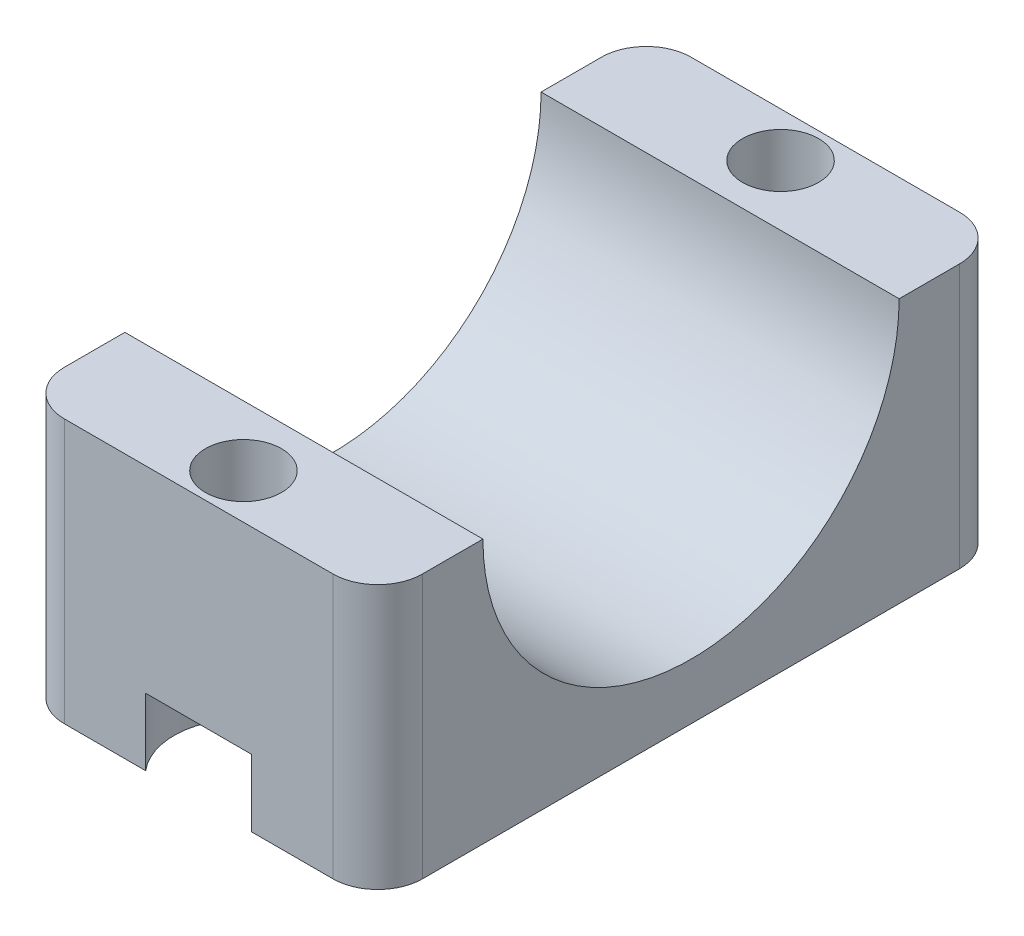
ISO-10303-21;
HEADER;
FILE_DESCRIPTION(('STEP AP214'),'2;1');
FILE_NAME('part.step','',(''),(''),'','','');
FILE_SCHEMA(('AUTOMOTIVE_DESIGN { 1 0 10303 214 1 1 1 1 }'));
ENDSEC;
DATA;
#1=APPLICATION_CONTEXT('core data for automotive mechanical design processes');
#2=APPLICATION_PROTOCOL_DEFINITION('international standard','automotive_design',2000,#1);
#3=PRODUCT_CONTEXT('',#1,'mechanical');
#4=PRODUCT('Part','Part','',(#3));
#5=PRODUCT_RELATED_PRODUCT_CATEGORY('part','',(#4));
#6=PRODUCT_DEFINITION_FORMATION('','',#4);
#7=PRODUCT_DEFINITION_CONTEXT('part definition',#1,'design');
#8=PRODUCT_DEFINITION('design','',#6,#7);
#9=PRODUCT_DEFINITION_SHAPE('','',#8);
#10=(LENGTH_UNIT() NAMED_UNIT(*) SI_UNIT(.MILLI.,.METRE.));
#11=(NAMED_UNIT(*) PLANE_ANGLE_UNIT() SI_UNIT($,.RADIAN.));
#12=(NAMED_UNIT(*) SI_UNIT($,.STERADIAN.) SOLID_ANGLE_UNIT());
#13=UNCERTAINTY_MEASURE_WITH_UNIT(LENGTH_MEASURE(1.E-05),#10,'distance_accuracy_value','');
#14=(GEOMETRIC_REPRESENTATION_CONTEXT(3) GLOBAL_UNCERTAINTY_ASSIGNED_CONTEXT((#13)) GLOBAL_UNIT_ASSIGNED_CONTEXT((#10,
#11,#12)) REPRESENTATION_CONTEXT('',''));
#15=CARTESIAN_POINT('',(0.,0.,0.));
#16=DIRECTION('',(0.,0.,1.));
#17=DIRECTION('',(1.,0.,0.));
#18=AXIS2_PLACEMENT_3D('',#15,#16,#17);
#19=CARTESIAN_POINT('',(58.,495.59,461.75));
#20=DIRECTION('',(0.,-1.,0.));
#21=DIRECTION('',(0.,0.,-1.));
#22=AXIS2_PLACEMENT_3D('',#19,#20,#21);
#23=PLANE('',#22);
#24=CARTESIAN_POINT('',(58.,495.59,461.75));
#25=DIRECTION('',(0.,-1.,0.));
#26=DIRECTION('',(1.,0.,0.));
#27=AXIS2_PLACEMENT_3D('',#24,#25,#26);
#28=CIRCLE('',#27,1.7);
#29=CARTESIAN_POINT('',(59.7,495.59,461.75));
#30=VERTEX_POINT('',#29);
#31=EDGE_CURVE('E42',#30,#30,#28,.T.);
#32=ORIENTED_EDGE('',*,*,#31,.F.);
#33=EDGE_LOOP('',(#32));
#34=FACE_BOUND('',#33,.T.);
#35=DIRECTION('',(1.,0.,0.));
#36=VECTOR('',#35,1.);
#37=CARTESIAN_POINT('',(54.,495.59,463.75));
#38=LINE('',#37,#36);
#39=CARTESIAN_POINT('',(55.631456143535,495.59,463.75));
#40=VERTEX_POINT('',#39);
#41=CARTESIAN_POINT('',(60.368543856465,495.59,463.75));
#42=VERTEX_POINT('',#41);
#43=EDGE_CURVE('E210',#40,#42,#38,.T.);
#44=ORIENTED_EDGE('',*,*,#43,.F.);
#45=CARTESIAN_POINT('',(58.,495.59,461.75));
#46=DIRECTION('',(0.,1.,0.));
#47=DIRECTION('',(0.764046405311039,0.,0.645161290323033));
#48=AXIS2_PLACEMENT_3D('',#45,#46,#47);
#49=CIRCLE('',#48,3.1);
#50=EDGE_CURVE('E217',#42,#40,#49,.T.);
#51=ORIENTED_EDGE('',*,*,#50,.F.);
#52=EDGE_LOOP('',(#44,#51));
#53=FACE_BOUND('',#52,.T.);
#54=ADVANCED_FACE('F15',(#34,#53),#23,.T.);
#55=CARTESIAN_POINT('',(58.,495.59,437.75));
#56=DIRECTION('',(0.,-1.,0.));
#57=DIRECTION('',(0.,0.,-1.));
#58=AXIS2_PLACEMENT_3D('',#55,#56,#57);
#59=PLANE('',#58);
#60=CARTESIAN_POINT('',(58.,495.59,437.75));
#61=DIRECTION('',(0.,-1.,0.));
#62=DIRECTION('',(1.,0.,0.));
#63=AXIS2_PLACEMENT_3D('',#60,#61,#62);
#64=CIRCLE('',#63,1.7);
#65=CARTESIAN_POINT('',(59.7,495.59,437.75));
#66=VERTEX_POINT('',#65);
#67=EDGE_CURVE('E9',#66,#66,#64,.T.);
#68=ORIENTED_EDGE('',*,*,#67,.F.);
#69=EDGE_LOOP('',(#68));
#70=FACE_BOUND('',#69,.T.);
#71=DIRECTION('',(1.,0.,0.));
#72=VECTOR('',#71,1.);
#73=CARTESIAN_POINT('',(54.,495.59,435.75));
#74=LINE('',#73,#72);
#75=CARTESIAN_POINT('',(55.631456143535,495.59,435.75));
#76=VERTEX_POINT('',#75);
#77=CARTESIAN_POINT('',(60.368543856465,495.59,435.75));
#78=VERTEX_POINT('',#77);
#79=EDGE_CURVE('E191',#76,#78,#74,.T.);
#80=ORIENTED_EDGE('',*,*,#79,.T.);
#81=CARTESIAN_POINT('',(58.,495.59,437.75));
#82=DIRECTION('',(0.,1.,0.));
#83=DIRECTION('',(-0.764046405311039,0.,-0.645161290323033));
#84=AXIS2_PLACEMENT_3D('',#81,#82,#83);
#85=CIRCLE('',#84,3.1);
#86=EDGE_CURVE('E195',#76,#78,#85,.T.);
#87=ORIENTED_EDGE('',*,*,#86,.F.);
#88=EDGE_LOOP('',(#80,#87));
#89=FACE_BOUND('',#88,.T.);
#90=ADVANCED_FACE('F361',(#70,#89),#59,.T.);
#91=CARTESIAN_POINT('',(58.,491.59,437.75));
#92=DIRECTION('',(0.,-1.,0.));
#93=DIRECTION('',(1.,0.,0.));
#94=AXIS2_PLACEMENT_3D('',#91,#92,#93);
#95=CYLINDRICAL_SURFACE('',#94,1.7);
#96=DIRECTION('',(0.,1.,0.));
#97=VECTOR('',#96,1.);
#98=CARTESIAN_POINT('',(59.7,491.59,437.75));
#99=LINE('',#98,#97);
#100=CARTESIAN_POINT('',(59.7,504.39,437.75));
#101=VERTEX_POINT('',#100);
#102=EDGE_CURVE('E23',#66,#101,#99,.T.);
#103=ORIENTED_EDGE('',*,*,#102,.T.);
#104=CARTESIAN_POINT('',(58.,504.39,437.75));
#105=DIRECTION('',(0.,-1.,0.));
#106=DIRECTION('',(1.,0.,0.));
#107=AXIS2_PLACEMENT_3D('',#104,#105,#106);
#108=CIRCLE('',#107,1.7);
#109=EDGE_CURVE('E164',#101,#101,#108,.T.);
#110=ORIENTED_EDGE('',*,*,#109,.F.);
#111=ORIENTED_EDGE('',*,*,#102,.F.);
#112=ORIENTED_EDGE('',*,*,#67,.T.);
#113=EDGE_LOOP('',(#103,#110,#111,#112));
#114=FACE_BOUND('',#113,.T.);
#115=ADVANCED_FACE('F163',(#114),#95,.F.);
#116=CARTESIAN_POINT('',(58.,491.59,461.75));
#117=DIRECTION('',(0.,-1.,0.));
#118=DIRECTION('',(1.,0.,0.));
#119=AXIS2_PLACEMENT_3D('',#116,#117,#118);
#120=CYLINDRICAL_SURFACE('',#119,1.7);
#121=DIRECTION('',(0.,1.,0.));
#122=VECTOR('',#121,1.);
#123=CARTESIAN_POINT('',(59.7,491.59,461.75));
#124=LINE('',#123,#122);
#125=CARTESIAN_POINT('',(59.7,504.39,461.75));
#126=VERTEX_POINT('',#125);
#127=EDGE_CURVE('E219',#30,#126,#124,.T.);
#128=ORIENTED_EDGE('',*,*,#127,.T.);
#129=CARTESIAN_POINT('',(58.,504.39,461.75));
#130=DIRECTION('',(0.,-1.,0.));
#131=DIRECTION('',(1.,0.,0.));
#132=AXIS2_PLACEMENT_3D('',#129,#130,#131);
#133=CIRCLE('',#132,1.7);
#134=EDGE_CURVE('E232',#126,#126,#133,.T.);
#135=ORIENTED_EDGE('',*,*,#134,.F.);
#136=ORIENTED_EDGE('',*,*,#127,.F.);
#137=ORIENTED_EDGE('',*,*,#31,.T.);
#138=EDGE_LOOP('',(#128,#135,#136,#137));
#139=FACE_BOUND('',#138,.T.);
#140=ADVANCED_FACE('F349',(#139),#120,.F.);
#141=CARTESIAN_POINT('',(58.,491.59,461.75));
#142=DIRECTION('',(0.,-1.,0.));
#143=DIRECTION('',(1.,0.,0.));
#144=AXIS2_PLACEMENT_3D('',#141,#142,#143);
#145=CYLINDRICAL_SURFACE('',#144,3.1);
#146=DIRECTION('',(0.,-1.,0.));
#147=VECTOR('',#146,1.);
#148=CARTESIAN_POINT('',(60.368543856465,491.59,463.75));
#149=LINE('',#148,#147);
#150=CARTESIAN_POINT('',(60.368543856462,492.59,463.75));
#151=VERTEX_POINT('',#150);
#152=EDGE_CURVE('E214',#42,#151,#149,.T.);
#153=ORIENTED_EDGE('',*,*,#152,.F.);
#154=ORIENTED_EDGE('',*,*,#50,.T.);
#155=DIRECTION('',(0.,-1.,0.));
#156=VECTOR('',#155,1.);
#157=CARTESIAN_POINT('',(55.631456143535,491.59,463.75));
#158=LINE('',#157,#156);
#159=CARTESIAN_POINT('',(55.631456143538,492.59,463.75));
#160=VERTEX_POINT('',#159);
#161=EDGE_CURVE('E207',#40,#160,#158,.T.);
#162=ORIENTED_EDGE('',*,*,#161,.T.);
#163=CARTESIAN_POINT('',(58.,492.59,461.75));
#164=DIRECTION('',(0.,1.,0.));
#165=DIRECTION('',(0.764046405311039,0.,0.645161290323033));
#166=AXIS2_PLACEMENT_3D('',#163,#164,#165);
#167=CIRCLE('',#166,3.1);
#168=EDGE_CURVE('E271',#151,#160,#167,.T.);
#169=ORIENTED_EDGE('',*,*,#168,.F.);
#170=EDGE_LOOP('',(#153,#154,#162,#169));
#171=FACE_BOUND('',#170,.T.);
#172=ADVANCED_FACE('F351',(#171),#145,.F.);
#173=CARTESIAN_POINT('',(50.,492.59,463.75));
#174=DIRECTION('',(0.,0.,1.));
#175=DIRECTION('',(1.,0.,0.));
#176=AXIS2_PLACEMENT_3D('',#173,#174,#175);
#177=PLANE('',#176);
#178=DIRECTION('',(1.,0.,0.));
#179=VECTOR('',#178,1.);
#180=CARTESIAN_POINT('',(50.,504.39,463.75));
#181=LINE('',#180,#179);
#182=CARTESIAN_POINT('',(52.,504.39,463.75));
#183=VERTEX_POINT('',#182);
#184=CARTESIAN_POINT('',(64.,504.39,463.75));
#185=VERTEX_POINT('',#184);
#186=EDGE_CURVE('E298',#183,#185,#181,.T.);
#187=ORIENTED_EDGE('',*,*,#186,.F.);
#188=DIRECTION('',(0.,1.,0.));
#189=VECTOR('',#188,1.);
#190=CARTESIAN_POINT('',(52.,492.59,463.75));
#191=LINE('',#190,#189);
#192=CARTESIAN_POINT('',(52.,492.59,463.75));
#193=VERTEX_POINT('',#192);
#194=EDGE_CURVE('E312',#193,#183,#191,.T.);
#195=ORIENTED_EDGE('',*,*,#194,.F.);
#196=DIRECTION('',(1.,0.,0.));
#197=VECTOR('',#196,1.);
#198=CARTESIAN_POINT('',(50.,492.59,463.75));
#199=LINE('',#198,#197);
#200=EDGE_CURVE('E303',#193,#160,#199,.T.);
#201=ORIENTED_EDGE('',*,*,#200,.T.);
#202=ORIENTED_EDGE('',*,*,#161,.F.);
#203=ORIENTED_EDGE('',*,*,#43,.T.);
#204=ORIENTED_EDGE('',*,*,#152,.T.);
#205=DIRECTION('',(1.,0.,0.));
#206=VECTOR('',#205,1.);
#207=CARTESIAN_POINT('',(50.,492.59,463.75));
#208=LINE('',#207,#206);
#209=CARTESIAN_POINT('',(64.,492.59,463.75));
#210=VERTEX_POINT('',#209);
#211=EDGE_CURVE('E267',#151,#210,#208,.T.);
#212=ORIENTED_EDGE('',*,*,#211,.T.);
#213=DIRECTION('',(0.,1.,0.));
#214=VECTOR('',#213,1.);
#215=CARTESIAN_POINT('',(64.,492.59,463.75));
#216=LINE('',#215,#214);
#217=EDGE_CURVE('E204',#210,#185,#216,.T.);
#218=ORIENTED_EDGE('',*,*,#217,.T.);
#219=EDGE_LOOP('',(#187,#195,#201,#202,#203,#204,#212,#218));
#220=FACE_BOUND('',#219,.T.);
#221=ADVANCED_FACE('F358',(#220),#177,.T.);
#222=CARTESIAN_POINT('',(64.,492.59,461.75));
#223=DIRECTION('',(0.,1.,0.));
#224=DIRECTION('',(1.,0.,0.));
#225=AXIS2_PLACEMENT_3D('',#222,#223,#224);
#226=CYLINDRICAL_SURFACE('',#225,2.);
#227=DIRECTION('',(0.,1.,0.));
#228=VECTOR('',#227,1.);
#229=CARTESIAN_POINT('',(66.,492.59,461.75));
#230=LINE('',#229,#228);
#231=CARTESIAN_POINT('',(66.,492.59,461.75));
#232=VERTEX_POINT('',#231);
#233=CARTESIAN_POINT('',(66.,504.39,461.75));
#234=VERTEX_POINT('',#233);
#235=EDGE_CURVE('E201',#232,#234,#230,.T.);
#236=ORIENTED_EDGE('',*,*,#235,.T.);
#237=CARTESIAN_POINT('',(64.,504.39,461.75));
#238=DIRECTION('',(0.,-1.,0.));
#239=DIRECTION('',(0.,0.,1.));
#240=AXIS2_PLACEMENT_3D('',#237,#238,#239);
#241=CIRCLE('',#240,2.);
#242=EDGE_CURVE('E337',#234,#185,#241,.T.);
#243=ORIENTED_EDGE('',*,*,#242,.T.);
#244=ORIENTED_EDGE('',*,*,#217,.F.);
#245=CARTESIAN_POINT('',(64.,492.59,461.75));
#246=DIRECTION('',(0.,-1.,0.));
#247=DIRECTION('',(0.,0.,1.));
#248=AXIS2_PLACEMENT_3D('',#245,#246,#247);
#249=CIRCLE('',#248,2.);
#250=EDGE_CURVE('E272',#232,#210,#249,.T.);
#251=ORIENTED_EDGE('',*,*,#250,.F.);
#252=EDGE_LOOP('',(#236,#243,#244,#251));
#253=FACE_BOUND('',#252,.T.);
#254=ADVANCED_FACE('F385',(#253),#226,.T.);
#255=CARTESIAN_POINT('',(66.,492.59,435.75));
#256=DIRECTION('',(1.,0.,0.));
#257=DIRECTION('',(0.,1.,0.));
#258=AXIS2_PLACEMENT_3D('',#255,#256,#257);
#259=PLANE('',#258);
#260=DIRECTION('',(0.,0.,1.));
#261=VECTOR('',#260,1.);
#262=CARTESIAN_POINT('',(66.,492.59,435.75));
#263=LINE('',#262,#261);
#264=CARTESIAN_POINT('',(66.,492.59,437.75));
#265=VERTEX_POINT('',#264);
#266=EDGE_CURVE('E262',#265,#232,#263,.T.);
#267=ORIENTED_EDGE('',*,*,#266,.F.);
#268=DIRECTION('',(0.,1.,0.));
#269=VECTOR('',#268,1.);
#270=CARTESIAN_POINT('',(66.,492.59,437.75));
#271=LINE('',#270,#269);
#272=CARTESIAN_POINT('',(66.,504.39,437.75));
#273=VERTEX_POINT('',#272);
#274=EDGE_CURVE('E198',#265,#273,#271,.T.);
#275=ORIENTED_EDGE('',*,*,#274,.T.);
#276=DIRECTION('',(0.,0.,1.));
#277=VECTOR('',#276,1.);
#278=CARTESIAN_POINT('',(66.,504.39,435.75));
#279=LINE('',#278,#277);
#280=CARTESIAN_POINT('',(66.,504.39,440.45));
#281=VERTEX_POINT('',#280);
#282=EDGE_CURVE('E180',#273,#281,#279,.T.);
#283=ORIENTED_EDGE('',*,*,#282,.T.);
#284=CARTESIAN_POINT('',(66.,504.39,449.75));
#285=DIRECTION('',(-1.,0.,0.));
#286=DIRECTION('',(0.,1.,0.));
#287=AXIS2_PLACEMENT_3D('',#284,#285,#286);
#288=CIRCLE('',#287,9.3);
#289=CARTESIAN_POINT('',(66.,504.39,459.04999999999));
#290=VERTEX_POINT('',#289);
#291=EDGE_CURVE('E234',#281,#290,#288,.T.);
#292=ORIENTED_EDGE('',*,*,#291,.T.);
#293=DIRECTION('',(0.,0.,1.));
#294=VECTOR('',#293,1.);
#295=CARTESIAN_POINT('',(66.,504.39,435.75));
#296=LINE('',#295,#294);
#297=EDGE_CURVE('E341',#290,#234,#296,.T.);
#298=ORIENTED_EDGE('',*,*,#297,.T.);
#299=ORIENTED_EDGE('',*,*,#235,.F.);
#300=EDGE_LOOP('',(#267,#275,#283,#292,#298,#299));
#301=FACE_BOUND('',#300,.T.);
#302=ADVANCED_FACE('F415',(#301),#259,.T.);
#303=CARTESIAN_POINT('',(64.,492.59,437.75));
#304=DIRECTION('',(0.,1.,0.));
#305=DIRECTION('',(1.,0.,0.));
#306=AXIS2_PLACEMENT_3D('',#303,#304,#305);
#307=CYLINDRICAL_SURFACE('',#306,2.);
#308=CARTESIAN_POINT('',(64.,492.59,437.75));
#309=DIRECTION('',(0.,1.,0.));
#310=DIRECTION('',(0.,0.,1.));
#311=AXIS2_PLACEMENT_3D('',#308,#309,#310);
#312=CIRCLE('',#311,2.);
#313=CARTESIAN_POINT('',(64.,492.59,435.75));
#314=VERTEX_POINT('',#313);
#315=EDGE_CURVE('E258',#265,#314,#312,.T.);
#316=ORIENTED_EDGE('',*,*,#315,.T.);
#317=DIRECTION('',(0.,1.,0.));
#318=VECTOR('',#317,1.);
#319=CARTESIAN_POINT('',(64.,492.59,435.75));
#320=LINE('',#319,#318);
#321=CARTESIAN_POINT('',(64.,504.39,435.75));
#322=VERTEX_POINT('',#321);
#323=EDGE_CURVE('E176',#314,#322,#320,.T.);
#324=ORIENTED_EDGE('',*,*,#323,.T.);
#325=CARTESIAN_POINT('',(64.,504.39,437.75));
#326=DIRECTION('',(0.,1.,0.));
#327=DIRECTION('',(0.,0.,1.));
#328=AXIS2_PLACEMENT_3D('',#325,#326,#327);
#329=CIRCLE('',#328,2.);
#330=EDGE_CURVE('E171',#273,#322,#329,.T.);
#331=ORIENTED_EDGE('',*,*,#330,.F.);
#332=ORIENTED_EDGE('',*,*,#274,.F.);
#333=EDGE_LOOP('',(#316,#324,#331,#332));
#334=FACE_BOUND('',#333,.T.);
#335=ADVANCED_FACE('F412',(#334),#307,.T.);
#336=CARTESIAN_POINT('',(58.,491.59,437.75));
#337=DIRECTION('',(0.,-1.,0.));
#338=DIRECTION('',(1.,0.,0.));
#339=AXIS2_PLACEMENT_3D('',#336,#337,#338);
#340=CYLINDRICAL_SURFACE('',#339,3.1);
#341=DIRECTION('',(0.,-1.,0.));
#342=VECTOR('',#341,1.);
#343=CARTESIAN_POINT('',(55.631456143535,491.59,435.75));
#344=LINE('',#343,#342);
#345=CARTESIAN_POINT('',(55.631456143538,492.59,435.75));
#346=VERTEX_POINT('',#345);
#347=EDGE_CURVE('E192',#76,#346,#344,.T.);
#348=ORIENTED_EDGE('',*,*,#347,.F.);
#349=ORIENTED_EDGE('',*,*,#86,.T.);
#350=DIRECTION('',(0.,-1.,0.));
#351=VECTOR('',#350,1.);
#352=CARTESIAN_POINT('',(60.368543856465,491.59,435.75));
#353=LINE('',#352,#351);
#354=CARTESIAN_POINT('',(60.368543856462,492.59,435.75));
#355=VERTEX_POINT('',#354);
#356=EDGE_CURVE('E188',#78,#355,#353,.T.);
#357=ORIENTED_EDGE('',*,*,#356,.T.);
#358=CARTESIAN_POINT('',(58.,492.59,437.75));
#359=DIRECTION('',(0.,1.,0.));
#360=DIRECTION('',(-0.764046405311039,0.,-0.645161290323033));
#361=AXIS2_PLACEMENT_3D('',#358,#359,#360);
#362=CIRCLE('',#361,3.1);
#363=EDGE_CURVE('E291',#346,#355,#362,.T.);
#364=ORIENTED_EDGE('',*,*,#363,.F.);
#365=EDGE_LOOP('',(#348,#349,#357,#364));
#366=FACE_BOUND('',#365,.T.);
#367=ADVANCED_FACE('F403',(#366),#340,.F.);
#368=CARTESIAN_POINT('',(50.,492.59,435.75));
#369=DIRECTION('',(0.,0.,1.));
#370=DIRECTION('',(1.,0.,0.));
#371=AXIS2_PLACEMENT_3D('',#368,#369,#370);
#372=PLANE('',#371);
#373=ORIENTED_EDGE('',*,*,#323,.F.);
#374=DIRECTION('',(1.,0.,0.));
#375=VECTOR('',#374,1.);
#376=CARTESIAN_POINT('',(50.,492.59,435.75));
#377=LINE('',#376,#375);
#378=EDGE_CURVE('E253',#355,#314,#377,.T.);
#379=ORIENTED_EDGE('',*,*,#378,.F.);
#380=ORIENTED_EDGE('',*,*,#356,.F.);
#381=ORIENTED_EDGE('',*,*,#79,.F.);
#382=ORIENTED_EDGE('',*,*,#347,.T.);
#383=DIRECTION('',(1.,0.,0.));
#384=VECTOR('',#383,1.);
#385=CARTESIAN_POINT('',(50.,492.59,435.75));
#386=LINE('',#385,#384);
#387=CARTESIAN_POINT('',(52.,492.59,435.75));
#388=VERTEX_POINT('',#387);
#389=EDGE_CURVE('E285',#388,#346,#386,.T.);
#390=ORIENTED_EDGE('',*,*,#389,.F.);
#391=DIRECTION('',(0.,1.,0.));
#392=VECTOR('',#391,1.);
#393=CARTESIAN_POINT('',(52.,492.59,435.75));
#394=LINE('',#393,#392);
#395=CARTESIAN_POINT('',(52.,504.39,435.75));
#396=VERTEX_POINT('',#395);
#397=EDGE_CURVE('E170',#388,#396,#394,.T.);
#398=ORIENTED_EDGE('',*,*,#397,.T.);
#399=DIRECTION('',(1.,0.,0.));
#400=VECTOR('',#399,1.);
#401=CARTESIAN_POINT('',(50.,504.39,435.75));
#402=LINE('',#401,#400);
#403=EDGE_CURVE('E235',#396,#322,#402,.T.);
#404=ORIENTED_EDGE('',*,*,#403,.T.);
#405=EDGE_LOOP('',(#373,#379,#380,#381,#382,#390,#398,#404));
#406=FACE_BOUND('',#405,.T.);
#407=ADVANCED_FACE('F407',(#406),#372,.F.);
#408=CARTESIAN_POINT('',(52.,492.59,437.75));
#409=DIRECTION('',(0.,1.,0.));
#410=DIRECTION('',(-1.,0.,0.));
#411=AXIS2_PLACEMENT_3D('',#408,#409,#410);
#412=CYLINDRICAL_SURFACE('',#411,2.);
#413=DIRECTION('',(0.,1.,0.));
#414=VECTOR('',#413,1.);
#415=CARTESIAN_POINT('',(50.,492.59,437.75));
#416=LINE('',#415,#414);
#417=CARTESIAN_POINT('',(50.,492.59,437.75));
#418=VERTEX_POINT('',#417);
#419=CARTESIAN_POINT('',(50.,504.39,437.75));
#420=VERTEX_POINT('',#419);
#421=EDGE_CURVE('E280',#418,#420,#416,.T.);
#422=ORIENTED_EDGE('',*,*,#421,.T.);
#423=CARTESIAN_POINT('',(52.,504.39,437.75));
#424=DIRECTION('',(0.,-1.,0.));
#425=DIRECTION('',(0.,0.,1.));
#426=AXIS2_PLACEMENT_3D('',#423,#424,#425);
#427=CIRCLE('',#426,2.);
#428=EDGE_CURVE('E183',#420,#396,#427,.T.);
#429=ORIENTED_EDGE('',*,*,#428,.T.);
#430=ORIENTED_EDGE('',*,*,#397,.F.);
#431=CARTESIAN_POINT('',(52.,492.59,437.75));
#432=DIRECTION('',(0.,-1.,0.));
#433=DIRECTION('',(0.,0.,1.));
#434=AXIS2_PLACEMENT_3D('',#431,#432,#433);
#435=CIRCLE('',#434,2.);
#436=EDGE_CURVE('E281',#418,#388,#435,.T.);
#437=ORIENTED_EDGE('',*,*,#436,.F.);
#438=EDGE_LOOP('',(#422,#429,#430,#437));
#439=FACE_BOUND('',#438,.T.);
#440=ADVANCED_FACE('F397',(#439),#412,.T.);
#441=CARTESIAN_POINT('',(50.,504.39,435.75));
#442=DIRECTION('',(0.,1.,0.));
#443=DIRECTION('',(1.,0.,0.));
#444=AXIS2_PLACEMENT_3D('',#441,#442,#443);
#445=PLANE('',#444);
#446=ORIENTED_EDGE('',*,*,#109,.T.);
#447=EDGE_LOOP('',(#446));
#448=FACE_BOUND('',#447,.T.);
#449=ORIENTED_EDGE('',*,*,#403,.F.);
#450=ORIENTED_EDGE('',*,*,#428,.F.);
#451=DIRECTION('',(0.,0.,1.));
#452=VECTOR('',#451,1.);
#453=CARTESIAN_POINT('',(50.,504.39,435.75));
#454=LINE('',#453,#452);
#455=CARTESIAN_POINT('',(50.,504.39,440.45));
#456=VERTEX_POINT('',#455);
#457=EDGE_CURVE('E276',#420,#456,#454,.T.);
#458=ORIENTED_EDGE('',*,*,#457,.T.);
#459=DIRECTION('',(-1.,0.,0.));
#460=VECTOR('',#459,1.);
#461=CARTESIAN_POINT('',(42.,504.39,440.45));
#462=LINE('',#461,#460);
#463=EDGE_CURVE('E233',#281,#456,#462,.T.);
#464=ORIENTED_EDGE('',*,*,#463,.F.);
#465=ORIENTED_EDGE('',*,*,#282,.F.);
#466=ORIENTED_EDGE('',*,*,#330,.T.);
#467=EDGE_LOOP('',(#449,#450,#458,#464,#465,#466));
#468=FACE_BOUND('',#467,.T.);
#469=ADVANCED_FACE('F167',(#448,#468),#445,.T.);
#470=CARTESIAN_POINT('',(42.,504.39,449.75));
#471=DIRECTION('',(-1.,0.,0.));
#472=DIRECTION('',(0.,1.,0.));
#473=AXIS2_PLACEMENT_3D('',#470,#471,#472);
#474=CYLINDRICAL_SURFACE('',#473,9.3);
#475=ORIENTED_EDGE('',*,*,#463,.T.);
#476=CARTESIAN_POINT('',(50.,504.39,449.75));
#477=DIRECTION('',(-1.,0.,0.));
#478=DIRECTION('',(0.,1.,0.));
#479=AXIS2_PLACEMENT_3D('',#476,#477,#478);
#480=CIRCLE('',#479,9.3);
#481=CARTESIAN_POINT('',(50.,504.39,459.04999999999));
#482=VERTEX_POINT('',#481);
#483=EDGE_CURVE('E266',#456,#482,#480,.T.);
#484=ORIENTED_EDGE('',*,*,#483,.T.);
#485=DIRECTION('',(-1.,0.,0.));
#486=VECTOR('',#485,1.);
#487=CARTESIAN_POINT('',(42.,504.39,459.05));
#488=LINE('',#487,#486);
#489=EDGE_CURVE('E295',#290,#482,#488,.T.);
#490=ORIENTED_EDGE('',*,*,#489,.F.);
#491=ORIENTED_EDGE('',*,*,#291,.F.);
#492=EDGE_LOOP('',(#475,#484,#490,#491));
#493=FACE_BOUND('',#492,.T.);
#494=ADVANCED_FACE('F487',(#493),#474,.F.);
#495=CARTESIAN_POINT('',(50.,504.39,435.75));
#496=DIRECTION('',(0.,1.,0.));
#497=DIRECTION('',(1.,0.,0.));
#498=AXIS2_PLACEMENT_3D('',#495,#496,#497);
#499=PLANE('',#498);
#500=ORIENTED_EDGE('',*,*,#134,.T.);
#501=EDGE_LOOP('',(#500));
#502=FACE_BOUND('',#501,.T.);
#503=ORIENTED_EDGE('',*,*,#489,.T.);
#504=DIRECTION('',(0.,0.,1.));
#505=VECTOR('',#504,1.);
#506=CARTESIAN_POINT('',(50.,504.39,435.75));
#507=LINE('',#506,#505);
#508=CARTESIAN_POINT('',(50.,504.39,461.75));
#509=VERTEX_POINT('',#508);
#510=EDGE_CURVE('E257',#482,#509,#507,.T.);
#511=ORIENTED_EDGE('',*,*,#510,.T.);
#512=CARTESIAN_POINT('',(52.,504.39,461.75));
#513=DIRECTION('',(0.,1.,0.));
#514=DIRECTION('',(0.,0.,1.));
#515=AXIS2_PLACEMENT_3D('',#512,#513,#514);
#516=CIRCLE('',#515,2.);
#517=EDGE_CURVE('E299',#509,#183,#516,.T.);
#518=ORIENTED_EDGE('',*,*,#517,.T.);
#519=ORIENTED_EDGE('',*,*,#186,.T.);
#520=ORIENTED_EDGE('',*,*,#242,.F.);
#521=ORIENTED_EDGE('',*,*,#297,.F.);
#522=EDGE_LOOP('',(#503,#511,#518,#519,#520,#521));
#523=FACE_BOUND('',#522,.T.);
#524=ADVANCED_FACE('F347',(#502,#523),#499,.T.);
#525=CARTESIAN_POINT('',(52.,492.59,461.75));
#526=DIRECTION('',(0.,1.,0.));
#527=DIRECTION('',(-1.,0.,0.));
#528=AXIS2_PLACEMENT_3D('',#525,#526,#527);
#529=CYLINDRICAL_SURFACE('',#528,2.);
#530=CARTESIAN_POINT('',(52.,492.59,461.75));
#531=DIRECTION('',(0.,1.,0.));
#532=DIRECTION('',(0.,0.,1.));
#533=AXIS2_PLACEMENT_3D('',#530,#531,#532);
#534=CIRCLE('',#533,2.);
#535=CARTESIAN_POINT('',(50.,492.59,461.75));
#536=VERTEX_POINT('',#535);
#537=EDGE_CURVE('E286',#536,#193,#534,.T.);
#538=ORIENTED_EDGE('',*,*,#537,.T.);
#539=ORIENTED_EDGE('',*,*,#194,.T.);
#540=ORIENTED_EDGE('',*,*,#517,.F.);
#541=DIRECTION('',(0.,1.,0.));
#542=VECTOR('',#541,1.);
#543=CARTESIAN_POINT('',(50.,492.59,461.75));
#544=LINE('',#543,#542);
#545=EDGE_CURVE('E254',#536,#509,#544,.T.);
#546=ORIENTED_EDGE('',*,*,#545,.F.);
#547=EDGE_LOOP('',(#538,#539,#540,#546));
#548=FACE_BOUND('',#547,.T.);
#549=ADVANCED_FACE('F388',(#548),#529,.T.);
#550=CARTESIAN_POINT('',(50.,492.59,435.75));
#551=DIRECTION('',(0.,1.,0.));
#552=DIRECTION('',(1.,0.,0.));
#553=AXIS2_PLACEMENT_3D('',#550,#551,#552);
#554=PLANE('',#553);
#555=ORIENTED_EDGE('',*,*,#363,.T.);
#556=ORIENTED_EDGE('',*,*,#378,.T.);
#557=ORIENTED_EDGE('',*,*,#315,.F.);
#558=ORIENTED_EDGE('',*,*,#266,.T.);
#559=ORIENTED_EDGE('',*,*,#250,.T.);
#560=ORIENTED_EDGE('',*,*,#211,.F.);
#561=ORIENTED_EDGE('',*,*,#168,.T.);
#562=ORIENTED_EDGE('',*,*,#200,.F.);
#563=ORIENTED_EDGE('',*,*,#537,.F.);
#564=DIRECTION('',(0.,0.,1.));
#565=VECTOR('',#564,1.);
#566=CARTESIAN_POINT('',(50.,492.59,435.75));
#567=LINE('',#566,#565);
#568=EDGE_CURVE('E287',#418,#536,#567,.T.);
#569=ORIENTED_EDGE('',*,*,#568,.F.);
#570=ORIENTED_EDGE('',*,*,#436,.T.);
#571=ORIENTED_EDGE('',*,*,#389,.T.);
#572=EDGE_LOOP('',(#555,#556,#557,#558,#559,#560,#561,#562,#563,#569,#570,#571));
#573=FACE_BOUND('',#572,.T.);
#574=ADVANCED_FACE('F381',(#573),#554,.F.);
#575=CARTESIAN_POINT('',(50.,492.59,435.75));
#576=DIRECTION('',(1.,0.,0.));
#577=DIRECTION('',(0.,1.,0.));
#578=AXIS2_PLACEMENT_3D('',#575,#576,#577);
#579=PLANE('',#578);
#580=ORIENTED_EDGE('',*,*,#545,.T.);
#581=ORIENTED_EDGE('',*,*,#510,.F.);
#582=ORIENTED_EDGE('',*,*,#483,.F.);
#583=ORIENTED_EDGE('',*,*,#457,.F.);
#584=ORIENTED_EDGE('',*,*,#421,.F.);
#585=ORIENTED_EDGE('',*,*,#568,.T.);
#586=EDGE_LOOP('',(#580,#581,#582,#583,#584,#585));
#587=FACE_BOUND('',#586,.T.);
#588=ADVANCED_FACE('F392',(#587),#579,.F.);
#589=CLOSED_SHELL('',(#54,#90,#115,#140,#172,#221,#254,#302,#335,#367,#407,#440,#469,#494,#524,
#549,#574,#588));
#590=MANIFOLD_SOLID_BREP('B1',#589);
#591=ADVANCED_BREP_SHAPE_REPRESENTATION('',(#18,#590),#14);
#592=SHAPE_DEFINITION_REPRESENTATION(#9,#591);
ENDSEC;
END-ISO-10303-21;
